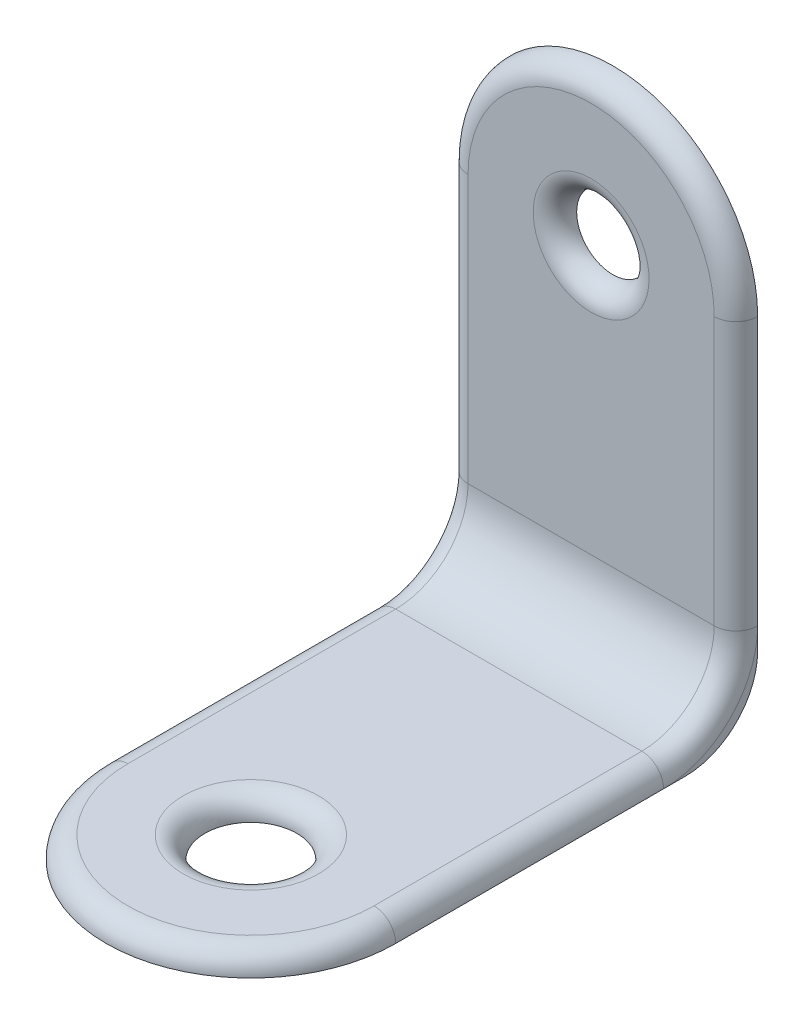
ISO-10303-21;
HEADER;
FILE_DESCRIPTION(('STEP AP214'),'2;1');
FILE_NAME('part.step','',(''),(''),'','','');
FILE_SCHEMA(('AUTOMOTIVE_DESIGN { 1 0 10303 214 1 1 1 1 }'));
ENDSEC;
DATA;
#1=APPLICATION_CONTEXT('core data for automotive mechanical design processes');
#2=APPLICATION_PROTOCOL_DEFINITION('international standard','automotive_design',2000,#1);
#3=PRODUCT_CONTEXT('',#1,'mechanical');
#4=PRODUCT('Part','Part','',(#3));
#5=PRODUCT_RELATED_PRODUCT_CATEGORY('part','',(#4));
#6=PRODUCT_DEFINITION_FORMATION('','',#4);
#7=PRODUCT_DEFINITION_CONTEXT('part definition',#1,'design');
#8=PRODUCT_DEFINITION('design','',#6,#7);
#9=PRODUCT_DEFINITION_SHAPE('','',#8);
#10=(LENGTH_UNIT() NAMED_UNIT(*) SI_UNIT(.MILLI.,.METRE.));
#11=(NAMED_UNIT(*) PLANE_ANGLE_UNIT() SI_UNIT($,.RADIAN.));
#12=(NAMED_UNIT(*) SI_UNIT($,.STERADIAN.) SOLID_ANGLE_UNIT());
#13=UNCERTAINTY_MEASURE_WITH_UNIT(LENGTH_MEASURE(1.E-05),#10,'distance_accuracy_value','');
#14=(GEOMETRIC_REPRESENTATION_CONTEXT(3) GLOBAL_UNCERTAINTY_ASSIGNED_CONTEXT((#13)) GLOBAL_UNIT_ASSIGNED_CONTEXT((#10,
#11,#12)) REPRESENTATION_CONTEXT('',''));
#15=CARTESIAN_POINT('',(0.,0.,0.));
#16=DIRECTION('',(0.,0.,1.));
#17=DIRECTION('',(1.,0.,0.));
#18=AXIS2_PLACEMENT_3D('',#15,#16,#17);
#19=CARTESIAN_POINT('',(-20.,3.,0.));
#20=DIRECTION('',(-1.,0.,0.));
#21=DIRECTION('',(0.,0.,1.));
#22=AXIS2_PLACEMENT_3D('',#19,#20,#21);
#23=PLANE('',#22);
#24=DIRECTION('',(0.,0.,-1.));
#25=VECTOR('',#24,1.);
#26=CARTESIAN_POINT('',(-20.,0.,0.));
#27=LINE('',#26,#25);
#28=CARTESIAN_POINT('',(-20.,0.,-37.));
#29=VERTEX_POINT('',#28);
#30=CARTESIAN_POINT('',(-20.,0.,-40.));
#31=VERTEX_POINT('',#30);
#32=EDGE_CURVE('E154',#29,#31,#27,.T.);
#33=ORIENTED_EDGE('',*,*,#32,.F.);
#34=CARTESIAN_POINT('',(-20.,13.,-37.));
#35=DIRECTION('',(-1.,0.,0.));
#36=DIRECTION('',(0.,0.,1.));
#37=AXIS2_PLACEMENT_3D('',#34,#35,#36);
#38=CIRCLE('',#37,13.);
#39=CARTESIAN_POINT('',(-20.,13.,-50.));
#40=VERTEX_POINT('',#39);
#41=EDGE_CURVE('E205',#29,#40,#38,.F.);
#42=ORIENTED_EDGE('',*,*,#41,.T.);
#43=DIRECTION('',(0.,-1.,0.));
#44=VECTOR('',#43,1.);
#45=CARTESIAN_POINT('',(-20.,3.,-50.));
#46=LINE('',#45,#44);
#47=CARTESIAN_POINT('',(-20.,10.,-50.));
#48=VERTEX_POINT('',#47);
#49=EDGE_CURVE('E134',#40,#48,#46,.T.);
#50=ORIENTED_EDGE('',*,*,#49,.T.);
#51=CARTESIAN_POINT('',(-20.,10.,-40.));
#52=DIRECTION('',(-1.,0.,0.));
#53=DIRECTION('',(0.,0.,1.));
#54=AXIS2_PLACEMENT_3D('',#51,#52,#53);
#55=CIRCLE('',#54,10.);
#56=EDGE_CURVE('E189',#48,#31,#55,.T.);
#57=ORIENTED_EDGE('',*,*,#56,.T.);
#58=EDGE_LOOP('',(#33,#42,#50,#57));
#59=FACE_BOUND('',#58,.T.);
#60=ADVANCED_FACE('F48',(#59),#23,.T.);
#61=CARTESIAN_POINT('',(20.,3.,0.));
#62=DIRECTION('',(1.,0.,0.));
#63=DIRECTION('',(0.,0.,-1.));
#64=AXIS2_PLACEMENT_3D('',#61,#62,#63);
#65=PLANE('',#64);
#66=DIRECTION('',(0.,-1.,0.));
#67=VECTOR('',#66,1.);
#68=CARTESIAN_POINT('',(20.,3.,-50.));
#69=LINE('',#68,#67);
#70=CARTESIAN_POINT('',(20.,13.,-50.));
#71=VERTEX_POINT('',#70);
#72=CARTESIAN_POINT('',(20.,10.,-50.));
#73=VERTEX_POINT('',#72);
#74=EDGE_CURVE('E138',#71,#73,#69,.T.);
#75=ORIENTED_EDGE('',*,*,#74,.F.);
#76=CARTESIAN_POINT('',(20.,13.,-37.));
#77=DIRECTION('',(1.,0.,0.));
#78=DIRECTION('',(0.,0.,-1.));
#79=AXIS2_PLACEMENT_3D('',#76,#77,#78);
#80=CIRCLE('',#79,13.);
#81=CARTESIAN_POINT('',(20.,0.,-37.));
#82=VERTEX_POINT('',#81);
#83=EDGE_CURVE('E192',#71,#82,#80,.F.);
#84=ORIENTED_EDGE('',*,*,#83,.T.);
#85=DIRECTION('',(0.,0.,1.));
#86=VECTOR('',#85,1.);
#87=CARTESIAN_POINT('',(20.,0.,0.));
#88=LINE('',#87,#86);
#89=CARTESIAN_POINT('',(20.,0.,-40.));
#90=VERTEX_POINT('',#89);
#91=EDGE_CURVE('E168',#90,#82,#88,.T.);
#92=ORIENTED_EDGE('',*,*,#91,.F.);
#93=CARTESIAN_POINT('',(20.,10.,-40.));
#94=DIRECTION('',(1.,0.,0.));
#95=DIRECTION('',(0.,0.,-1.));
#96=AXIS2_PLACEMENT_3D('',#93,#94,#95);
#97=CIRCLE('',#96,10.);
#98=EDGE_CURVE('E184',#90,#73,#97,.T.);
#99=ORIENTED_EDGE('',*,*,#98,.T.);
#100=EDGE_LOOP('',(#75,#84,#92,#99));
#101=FACE_BOUND('',#100,.T.);
#102=ADVANCED_FACE('F253',(#101),#65,.T.);
#103=CARTESIAN_POINT('',(0.,3.,-50.));
#104=DIRECTION('',(0.,0.,-1.));
#105=DIRECTION('',(-1.,0.,0.));
#106=AXIS2_PLACEMENT_3D('',#103,#104,#105);
#107=PLANE('',#106);
#108=CARTESIAN_POINT('',(20.,50.,-50.));
#109=VERTEX_POINT('',#108);
#110=EDGE_CURVE('E174',#109,#71,#69,.T.);
#111=ORIENTED_EDGE('',*,*,#110,.T.);
#112=ORIENTED_EDGE('',*,*,#74,.T.);
#113=DIRECTION('',(1.,0.,0.));
#114=VECTOR('',#113,1.);
#115=CARTESIAN_POINT('',(-20.,10.,-50.));
#116=LINE('',#115,#114);
#117=EDGE_CURVE('E187',#73,#48,#116,.F.);
#118=ORIENTED_EDGE('',*,*,#117,.T.);
#119=ORIENTED_EDGE('',*,*,#49,.F.);
#120=CARTESIAN_POINT('',(-20.,50.,-50.));
#121=VERTEX_POINT('',#120);
#122=EDGE_CURVE('E125',#121,#40,#46,.T.);
#123=ORIENTED_EDGE('',*,*,#122,.F.);
#124=CARTESIAN_POINT('',(0.,50.,-50.));
#125=DIRECTION('',(0.,0.,-1.));
#126=DIRECTION('',(1.,0.,0.));
#127=AXIS2_PLACEMENT_3D('',#124,#125,#126);
#128=CIRCLE('',#127,20.);
#129=EDGE_CURVE('E131',#121,#109,#128,.T.);
#130=ORIENTED_EDGE('',*,*,#129,.T.);
#131=EDGE_LOOP('',(#111,#112,#118,#119,#123,#130));
#132=FACE_BOUND('',#131,.T.);
#133=CARTESIAN_POINT('',(0.,50.,-50.));
#134=DIRECTION('',(0.,0.,-1.));
#135=DIRECTION('',(-1.,0.,0.));
#136=AXIS2_PLACEMENT_3D('',#133,#134,#135);
#137=CIRCLE('',#136,5.);
#138=CARTESIAN_POINT('',(-5.,50.,-50.));
#139=VERTEX_POINT('',#138);
#140=EDGE_CURVE('E155',#139,#139,#137,.T.);
#141=ORIENTED_EDGE('',*,*,#140,.F.);
#142=EDGE_LOOP('',(#141));
#143=FACE_BOUND('',#142,.T.);
#144=ADVANCED_FACE('F128',(#132,#143),#107,.T.);
#145=CARTESIAN_POINT('',(0.,3.,0.));
#146=DIRECTION('',(0.,1.,0.));
#147=DIRECTION('',(0.,0.,1.));
#148=AXIS2_PLACEMENT_3D('',#145,#146,#147);
#149=PLANE('',#148);
#150=CARTESIAN_POINT('',(0.,3.,0.));
#151=DIRECTION('',(0.,1.,0.));
#152=DIRECTION('',(0.,0.,1.));
#153=AXIS2_PLACEMENT_3D('',#150,#151,#152);
#154=CIRCLE('',#153,9.35);
#155=CARTESIAN_POINT('',(0.,3.,9.35));
#156=VERTEX_POINT('',#155);
#157=EDGE_CURVE('E56',#156,#156,#154,.F.);
#158=ORIENTED_EDGE('',*,*,#157,.T.);
#159=EDGE_LOOP('',(#158));
#160=FACE_BOUND('',#159,.T.);
#161=DIRECTION('',(1.,0.,0.));
#162=VECTOR('',#161,1.);
#163=CARTESIAN_POINT('',(-20.,3.,-37.));
#164=LINE('',#163,#162);
#165=CARTESIAN_POINT('',(17.,3.,-37.));
#166=VERTEX_POINT('',#165);
#167=CARTESIAN_POINT('',(-17.,3.,-37.));
#168=VERTEX_POINT('',#167);
#169=EDGE_CURVE('E179',#166,#168,#164,.F.);
#170=ORIENTED_EDGE('',*,*,#169,.T.);
#171=DIRECTION('',(0.,0.,-1.));
#172=VECTOR('',#171,1.);
#173=CARTESIAN_POINT('',(-17.,3.,0.));
#174=LINE('',#173,#172);
#175=CARTESIAN_POINT('',(-17.,3.,0.));
#176=VERTEX_POINT('',#175);
#177=EDGE_CURVE('E63',#168,#176,#174,.F.);
#178=ORIENTED_EDGE('',*,*,#177,.T.);
#179=CARTESIAN_POINT('',(0.,3.,0.));
#180=DIRECTION('',(0.,1.,0.));
#181=DIRECTION('',(0.,0.,1.));
#182=AXIS2_PLACEMENT_3D('',#179,#180,#181);
#183=CIRCLE('',#182,17.);
#184=CARTESIAN_POINT('',(17.,3.,0.));
#185=VERTEX_POINT('',#184);
#186=EDGE_CURVE('E68',#176,#185,#183,.T.);
#187=ORIENTED_EDGE('',*,*,#186,.T.);
#188=DIRECTION('',(0.,0.,1.));
#189=VECTOR('',#188,1.);
#190=CARTESIAN_POINT('',(17.,3.,0.));
#191=LINE('',#190,#189);
#192=EDGE_CURVE('E207',#185,#166,#191,.F.);
#193=ORIENTED_EDGE('',*,*,#192,.T.);
#194=EDGE_LOOP('',(#170,#178,#187,#193));
#195=FACE_BOUND('',#194,.T.);
#196=ADVANCED_FACE('F234',(#160,#195),#149,.T.);
#197=CARTESIAN_POINT('',(0.,0.,0.));
#198=DIRECTION('',(0.,1.,0.));
#199=DIRECTION('',(0.,0.,1.));
#200=AXIS2_PLACEMENT_3D('',#197,#198,#199);
#201=PLANE('',#200);
#202=CARTESIAN_POINT('',(-20.,0.,0.));
#203=VERTEX_POINT('',#202);
#204=EDGE_CURVE('E157',#203,#29,#27,.T.);
#205=ORIENTED_EDGE('',*,*,#204,.T.);
#206=ORIENTED_EDGE('',*,*,#32,.T.);
#207=DIRECTION('',(1.,0.,0.));
#208=VECTOR('',#207,1.);
#209=CARTESIAN_POINT('',(20.,0.,-40.));
#210=LINE('',#209,#208);
#211=EDGE_CURVE('E181',#31,#90,#210,.T.);
#212=ORIENTED_EDGE('',*,*,#211,.T.);
#213=ORIENTED_EDGE('',*,*,#91,.T.);
#214=CARTESIAN_POINT('',(20.,0.,0.));
#215=VERTEX_POINT('',#214);
#216=EDGE_CURVE('E167',#82,#215,#88,.T.);
#217=ORIENTED_EDGE('',*,*,#216,.T.);
#218=CARTESIAN_POINT('',(0.,0.,0.));
#219=DIRECTION('',(0.,1.,0.));
#220=DIRECTION('',(0.,0.,1.));
#221=AXIS2_PLACEMENT_3D('',#218,#219,#220);
#222=CIRCLE('',#221,20.);
#223=EDGE_CURVE('E164',#203,#215,#222,.T.);
#224=ORIENTED_EDGE('',*,*,#223,.F.);
#225=EDGE_LOOP('',(#205,#206,#212,#213,#217,#224));
#226=FACE_BOUND('',#225,.T.);
#227=CARTESIAN_POINT('',(0.,0.,0.));
#228=DIRECTION('',(0.,1.,0.));
#229=DIRECTION('',(0.,0.,1.));
#230=AXIS2_PLACEMENT_3D('',#227,#228,#229);
#231=CIRCLE('',#230,6.35);
#232=CARTESIAN_POINT('',(0.,0.,6.35));
#233=VERTEX_POINT('',#232);
#234=EDGE_CURVE('E171',#233,#233,#231,.T.);
#235=ORIENTED_EDGE('',*,*,#234,.T.);
#236=EDGE_LOOP('',(#235));
#237=FACE_BOUND('',#236,.T.);
#238=ADVANCED_FACE('F260',(#226,#237),#201,.F.);
#239=CARTESIAN_POINT('',(0.,50.,-47.));
#240=DIRECTION('',(0.,0.,1.));
#241=DIRECTION('',(1.,0.,0.));
#242=AXIS2_PLACEMENT_3D('',#239,#240,#241);
#243=PLANE('',#242);
#244=CARTESIAN_POINT('',(0.,50.,-47.));
#245=DIRECTION('',(0.,0.,1.));
#246=DIRECTION('',(1.,0.,0.));
#247=AXIS2_PLACEMENT_3D('',#244,#245,#246);
#248=CIRCLE('',#247,8.);
#249=CARTESIAN_POINT('',(8.,50.,-47.));
#250=VERTEX_POINT('',#249);
#251=EDGE_CURVE('E11',#250,#250,#248,.F.);
#252=ORIENTED_EDGE('',*,*,#251,.T.);
#253=EDGE_LOOP('',(#252));
#254=FACE_BOUND('',#253,.T.);
#255=DIRECTION('',(1.,0.,0.));
#256=VECTOR('',#255,1.);
#257=CARTESIAN_POINT('',(20.,13.,-47.));
#258=LINE('',#257,#256);
#259=CARTESIAN_POINT('',(-17.,13.,-47.));
#260=VERTEX_POINT('',#259);
#261=CARTESIAN_POINT('',(17.,13.,-47.));
#262=VERTEX_POINT('',#261);
#263=EDGE_CURVE('E176',#260,#262,#258,.T.);
#264=ORIENTED_EDGE('',*,*,#263,.T.);
#265=DIRECTION('',(0.,-1.,0.));
#266=VECTOR('',#265,1.);
#267=CARTESIAN_POINT('',(17.,50.,-47.));
#268=LINE('',#267,#266);
#269=CARTESIAN_POINT('',(17.,50.,-47.));
#270=VERTEX_POINT('',#269);
#271=EDGE_CURVE('E203',#262,#270,#268,.F.);
#272=ORIENTED_EDGE('',*,*,#271,.T.);
#273=CARTESIAN_POINT('',(0.,50.,-47.));
#274=DIRECTION('',(0.,0.,1.));
#275=DIRECTION('',(1.,0.,0.));
#276=AXIS2_PLACEMENT_3D('',#273,#274,#275);
#277=CIRCLE('',#276,17.);
#278=CARTESIAN_POINT('',(-17.,50.,-47.));
#279=VERTEX_POINT('',#278);
#280=EDGE_CURVE('E201',#270,#279,#277,.T.);
#281=ORIENTED_EDGE('',*,*,#280,.T.);
#282=DIRECTION('',(0.,1.,0.));
#283=VECTOR('',#282,1.);
#284=CARTESIAN_POINT('',(-17.,50.,-47.));
#285=LINE('',#284,#283);
#286=EDGE_CURVE('E144',#279,#260,#285,.F.);
#287=ORIENTED_EDGE('',*,*,#286,.T.);
#288=EDGE_LOOP('',(#264,#272,#281,#287));
#289=FACE_BOUND('',#288,.T.);
#290=ADVANCED_FACE('F246',(#254,#289),#243,.T.);
#291=CARTESIAN_POINT('',(0.,13.,-37.));
#292=DIRECTION('',(-1.,0.,0.));
#293=DIRECTION('',(0.,0.,1.));
#294=AXIS2_PLACEMENT_3D('',#291,#292,#293);
#295=CYLINDRICAL_SURFACE('',#294,10.);
#296=ORIENTED_EDGE('',*,*,#169,.F.);
#297=CARTESIAN_POINT('',(17.,13.,-37.));
#298=DIRECTION('',(1.,0.,0.));
#299=DIRECTION('',(0.,0.,-1.));
#300=AXIS2_PLACEMENT_3D('',#297,#298,#299);
#301=CIRCLE('',#300,10.);
#302=EDGE_CURVE('E197',#166,#262,#301,.T.);
#303=ORIENTED_EDGE('',*,*,#302,.T.);
#304=ORIENTED_EDGE('',*,*,#263,.F.);
#305=CARTESIAN_POINT('',(-17.,13.,-37.));
#306=DIRECTION('',(-1.,0.,0.));
#307=DIRECTION('',(0.,0.,1.));
#308=AXIS2_PLACEMENT_3D('',#305,#306,#307);
#309=CIRCLE('',#308,10.);
#310=EDGE_CURVE('E195',#260,#168,#309,.T.);
#311=ORIENTED_EDGE('',*,*,#310,.T.);
#312=EDGE_LOOP('',(#296,#303,#304,#311));
#313=FACE_BOUND('',#312,.T.);
#314=ADVANCED_FACE('F232',(#313),#295,.F.);
#315=CARTESIAN_POINT('',(0.,10.,-40.));
#316=DIRECTION('',(-1.,0.,0.));
#317=DIRECTION('',(0.,0.,1.));
#318=AXIS2_PLACEMENT_3D('',#315,#316,#317);
#319=CYLINDRICAL_SURFACE('',#318,10.);
#320=ORIENTED_EDGE('',*,*,#56,.F.);
#321=ORIENTED_EDGE('',*,*,#117,.F.);
#322=ORIENTED_EDGE('',*,*,#98,.F.);
#323=ORIENTED_EDGE('',*,*,#211,.F.);
#324=EDGE_LOOP('',(#320,#321,#322,#323));
#325=FACE_BOUND('',#324,.T.);
#326=ADVANCED_FACE('F256',(#325),#319,.T.);
#327=CARTESIAN_POINT('',(-17.,13.,-37.));
#328=DIRECTION('',(-1.,0.,0.));
#329=DIRECTION('',(0.,0.,1.));
#330=AXIS2_PLACEMENT_3D('',#327,#328,#329);
#331=TOROIDAL_SURFACE('',#330,13.,3.);
#332=CARTESIAN_POINT('',(-17.,0.,-37.));
#333=DIRECTION('',(0.,0.,1.));
#334=DIRECTION('',(1.,0.,0.));
#335=AXIS2_PLACEMENT_3D('',#332,#333,#334);
#336=CIRCLE('',#335,3.);
#337=EDGE_CURVE('E147',#168,#29,#336,.T.);
#338=ORIENTED_EDGE('',*,*,#337,.F.);
#339=ORIENTED_EDGE('',*,*,#310,.F.);
#340=CARTESIAN_POINT('',(-17.,13.,-50.));
#341=DIRECTION('',(0.,1.,0.));
#342=DIRECTION('',(0.,0.,1.));
#343=AXIS2_PLACEMENT_3D('',#340,#341,#342);
#344=CIRCLE('',#343,3.);
#345=EDGE_CURVE('E160',#40,#260,#344,.T.);
#346=ORIENTED_EDGE('',*,*,#345,.F.);
#347=ORIENTED_EDGE('',*,*,#41,.F.);
#348=EDGE_LOOP('',(#338,#339,#346,#347));
#349=FACE_BOUND('',#348,.T.);
#350=ADVANCED_FACE('F228',(#349),#331,.T.);
#351=CARTESIAN_POINT('',(-17.,3.,-50.));
#352=DIRECTION('',(0.,1.,0.));
#353=DIRECTION('',(0.,0.,1.));
#354=AXIS2_PLACEMENT_3D('',#351,#352,#353);
#355=CYLINDRICAL_SURFACE('',#354,3.);
#356=ORIENTED_EDGE('',*,*,#345,.T.);
#357=ORIENTED_EDGE('',*,*,#286,.F.);
#358=CARTESIAN_POINT('',(-17.,50.,-50.));
#359=DIRECTION('',(0.,1.,0.));
#360=DIRECTION('',(0.,0.,1.));
#361=AXIS2_PLACEMENT_3D('',#358,#359,#360);
#362=CIRCLE('',#361,3.);
#363=EDGE_CURVE('E142',#121,#279,#362,.T.);
#364=ORIENTED_EDGE('',*,*,#363,.F.);
#365=ORIENTED_EDGE('',*,*,#122,.T.);
#366=EDGE_LOOP('',(#356,#357,#364,#365));
#367=FACE_BOUND('',#366,.T.);
#368=ADVANCED_FACE('F143',(#367),#355,.T.);
#369=CARTESIAN_POINT('',(-17.,0.,0.));
#370=DIRECTION('',(0.,0.,-1.));
#371=DIRECTION('',(-1.,0.,0.));
#372=AXIS2_PLACEMENT_3D('',#369,#370,#371);
#373=CYLINDRICAL_SURFACE('',#372,3.);
#374=ORIENTED_EDGE('',*,*,#337,.T.);
#375=ORIENTED_EDGE('',*,*,#204,.F.);
#376=CARTESIAN_POINT('',(-17.,0.,0.));
#377=DIRECTION('',(0.,0.,1.));
#378=DIRECTION('',(1.,0.,0.));
#379=AXIS2_PLACEMENT_3D('',#376,#377,#378);
#380=CIRCLE('',#379,3.);
#381=EDGE_CURVE('E148',#176,#203,#380,.T.);
#382=ORIENTED_EDGE('',*,*,#381,.F.);
#383=ORIENTED_EDGE('',*,*,#177,.F.);
#384=EDGE_LOOP('',(#374,#375,#382,#383));
#385=FACE_BOUND('',#384,.T.);
#386=ADVANCED_FACE('F263',(#385),#373,.T.);
#387=CARTESIAN_POINT('',(0.,50.,-50.));
#388=DIRECTION('',(0.,0.,1.));
#389=DIRECTION('',(1.,0.,0.));
#390=AXIS2_PLACEMENT_3D('',#387,#388,#389);
#391=TOROIDAL_SURFACE('',#390,17.,3.);
#392=ORIENTED_EDGE('',*,*,#363,.T.);
#393=ORIENTED_EDGE('',*,*,#280,.F.);
#394=CARTESIAN_POINT('',(17.,50.,-50.));
#395=DIRECTION('',(0.,-1.,0.));
#396=DIRECTION('',(0.,0.,-1.));
#397=AXIS2_PLACEMENT_3D('',#394,#395,#396);
#398=CIRCLE('',#397,3.);
#399=EDGE_CURVE('E152',#109,#270,#398,.T.);
#400=ORIENTED_EDGE('',*,*,#399,.F.);
#401=ORIENTED_EDGE('',*,*,#129,.F.);
#402=EDGE_LOOP('',(#392,#393,#400,#401));
#403=FACE_BOUND('',#402,.T.);
#404=ADVANCED_FACE('F150',(#403),#391,.T.);
#405=CARTESIAN_POINT('',(0.,0.,0.));
#406=DIRECTION('',(0.,1.,0.));
#407=DIRECTION('',(0.,0.,1.));
#408=AXIS2_PLACEMENT_3D('',#405,#406,#407);
#409=TOROIDAL_SURFACE('',#408,17.,3.);
#410=ORIENTED_EDGE('',*,*,#381,.T.);
#411=ORIENTED_EDGE('',*,*,#223,.T.);
#412=CARTESIAN_POINT('',(17.,0.,0.));
#413=DIRECTION('',(0.,0.,-1.));
#414=DIRECTION('',(-1.,0.,0.));
#415=AXIS2_PLACEMENT_3D('',#412,#413,#414);
#416=CIRCLE('',#415,3.);
#417=EDGE_CURVE('E217',#185,#215,#416,.T.);
#418=ORIENTED_EDGE('',*,*,#417,.F.);
#419=ORIENTED_EDGE('',*,*,#186,.F.);
#420=EDGE_LOOP('',(#410,#411,#418,#419));
#421=FACE_BOUND('',#420,.T.);
#422=ADVANCED_FACE('F265',(#421),#409,.T.);
#423=CARTESIAN_POINT('',(17.,3.,-50.));
#424=DIRECTION('',(0.,-1.,0.));
#425=DIRECTION('',(0.,0.,-1.));
#426=AXIS2_PLACEMENT_3D('',#423,#424,#425);
#427=CYLINDRICAL_SURFACE('',#426,3.);
#428=ORIENTED_EDGE('',*,*,#399,.T.);
#429=ORIENTED_EDGE('',*,*,#271,.F.);
#430=CARTESIAN_POINT('',(17.,13.,-50.));
#431=DIRECTION('',(0.,-1.,0.));
#432=DIRECTION('',(0.,0.,-1.));
#433=AXIS2_PLACEMENT_3D('',#430,#431,#432);
#434=CIRCLE('',#433,3.);
#435=EDGE_CURVE('E215',#71,#262,#434,.T.);
#436=ORIENTED_EDGE('',*,*,#435,.F.);
#437=ORIENTED_EDGE('',*,*,#110,.F.);
#438=EDGE_LOOP('',(#428,#429,#436,#437));
#439=FACE_BOUND('',#438,.T.);
#440=ADVANCED_FACE('F248',(#439),#427,.T.);
#441=CARTESIAN_POINT('',(17.,0.,0.));
#442=DIRECTION('',(0.,0.,1.));
#443=DIRECTION('',(1.,0.,0.));
#444=AXIS2_PLACEMENT_3D('',#441,#442,#443);
#445=CYLINDRICAL_SURFACE('',#444,3.);
#446=ORIENTED_EDGE('',*,*,#417,.T.);
#447=ORIENTED_EDGE('',*,*,#216,.F.);
#448=CARTESIAN_POINT('',(17.,0.,-37.));
#449=DIRECTION('',(0.,0.,-1.));
#450=DIRECTION('',(-1.,0.,0.));
#451=AXIS2_PLACEMENT_3D('',#448,#449,#450);
#452=CIRCLE('',#451,3.);
#453=EDGE_CURVE('E213',#166,#82,#452,.T.);
#454=ORIENTED_EDGE('',*,*,#453,.F.);
#455=ORIENTED_EDGE('',*,*,#192,.F.);
#456=EDGE_LOOP('',(#446,#447,#454,#455));
#457=FACE_BOUND('',#456,.T.);
#458=ADVANCED_FACE('F238',(#457),#445,.T.);
#459=CARTESIAN_POINT('',(17.,13.,-37.));
#460=DIRECTION('',(1.,0.,0.));
#461=DIRECTION('',(0.,0.,-1.));
#462=AXIS2_PLACEMENT_3D('',#459,#460,#461);
#463=TOROIDAL_SURFACE('',#462,13.,3.);
#464=ORIENTED_EDGE('',*,*,#435,.T.);
#465=ORIENTED_EDGE('',*,*,#302,.F.);
#466=ORIENTED_EDGE('',*,*,#453,.T.);
#467=ORIENTED_EDGE('',*,*,#83,.F.);
#468=EDGE_LOOP('',(#464,#465,#466,#467));
#469=FACE_BOUND('',#468,.T.);
#470=ADVANCED_FACE('F242',(#469),#463,.T.);
#471=CARTESIAN_POINT('',(0.,0.,0.));
#472=DIRECTION('',(0.,1.,0.));
#473=DIRECTION('',(0.,0.,1.));
#474=AXIS2_PLACEMENT_3D('',#471,#472,#473);
#475=TOROIDAL_SURFACE('',#474,9.35,3.);
#476=ORIENTED_EDGE('',*,*,#157,.F.);
#477=EDGE_LOOP('',(#476));
#478=FACE_BOUND('',#477,.T.);
#479=ORIENTED_EDGE('',*,*,#234,.F.);
#480=EDGE_LOOP('',(#479));
#481=FACE_BOUND('',#480,.T.);
#482=ADVANCED_FACE('F288',(#478,#481),#475,.T.);
#483=CARTESIAN_POINT('',(0.,50.,-50.));
#484=DIRECTION('',(0.,0.,1.));
#485=DIRECTION('',(1.,0.,0.));
#486=AXIS2_PLACEMENT_3D('',#483,#484,#485);
#487=TOROIDAL_SURFACE('',#486,8.,3.);
#488=ORIENTED_EDGE('',*,*,#140,.T.);
#489=EDGE_LOOP('',(#488));
#490=FACE_BOUND('',#489,.T.);
#491=ORIENTED_EDGE('',*,*,#251,.F.);
#492=EDGE_LOOP('',(#491));
#493=FACE_BOUND('',#492,.T.);
#494=ADVANCED_FACE('F50',(#490,#493),#487,.T.);
#495=CLOSED_SHELL('',(#60,#102,#144,#196,#238,#290,#314,#326,#350,#368,#386,#404,#422,#440,#458,
#470,#482,#494));
#496=MANIFOLD_SOLID_BREP('B2',#495);
#497=ADVANCED_BREP_SHAPE_REPRESENTATION('',(#18,#496),#14);
#498=SHAPE_DEFINITION_REPRESENTATION(#9,#497);
ENDSEC;
END-ISO-10303-21;
